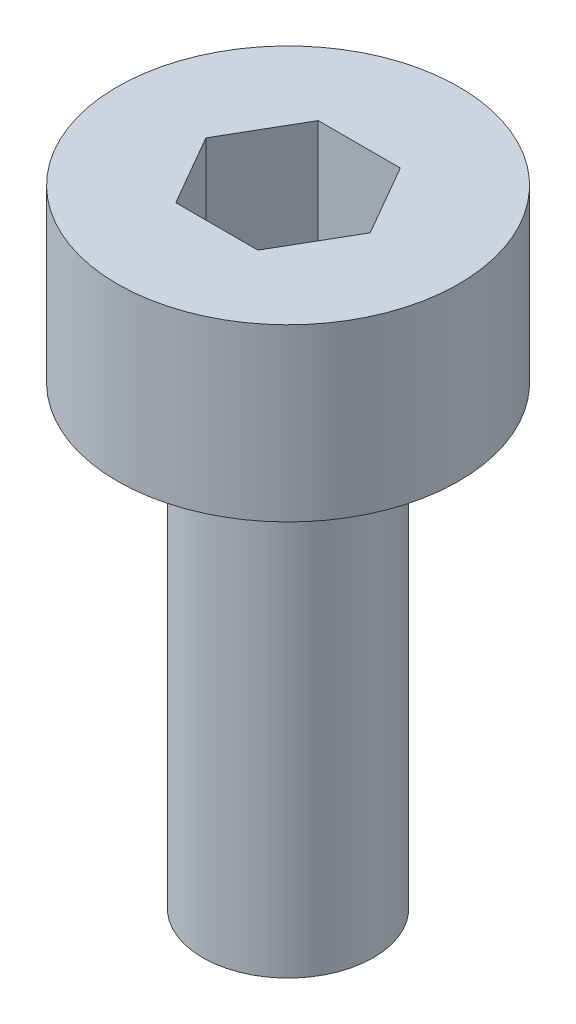
ISO-10303-21;
HEADER;
FILE_DESCRIPTION(('STEP AP214'),'2;1');
FILE_NAME('part.step','',(''),(''),'','','');
FILE_SCHEMA(('AUTOMOTIVE_DESIGN { 1 0 10303 214 1 1 1 1 }'));
ENDSEC;
DATA;
#1=APPLICATION_CONTEXT('core data for automotive mechanical design processes');
#2=APPLICATION_PROTOCOL_DEFINITION('international standard','automotive_design',2000,#1);
#3=PRODUCT_CONTEXT('',#1,'mechanical');
#4=PRODUCT('Part','Part','',(#3));
#5=PRODUCT_RELATED_PRODUCT_CATEGORY('part','',(#4));
#6=PRODUCT_DEFINITION_FORMATION('','',#4);
#7=PRODUCT_DEFINITION_CONTEXT('part definition',#1,'design');
#8=PRODUCT_DEFINITION('design','',#6,#7);
#9=PRODUCT_DEFINITION_SHAPE('','',#8);
#10=(LENGTH_UNIT() NAMED_UNIT(*) SI_UNIT(.MILLI.,.METRE.));
#11=(NAMED_UNIT(*) PLANE_ANGLE_UNIT() SI_UNIT($,.RADIAN.));
#12=(NAMED_UNIT(*) SI_UNIT($,.STERADIAN.) SOLID_ANGLE_UNIT());
#13=UNCERTAINTY_MEASURE_WITH_UNIT(LENGTH_MEASURE(1.E-05),#10,'distance_accuracy_value','');
#14=(GEOMETRIC_REPRESENTATION_CONTEXT(3) GLOBAL_UNCERTAINTY_ASSIGNED_CONTEXT((#13)) GLOBAL_UNIT_ASSIGNED_CONTEXT((#10,
#11,#12)) REPRESENTATION_CONTEXT('',''));
#15=CARTESIAN_POINT('',(0.,0.,0.));
#16=DIRECTION('',(0.,0.,1.));
#17=DIRECTION('',(1.,0.,0.));
#18=AXIS2_PLACEMENT_3D('',#15,#16,#17);
#19=CARTESIAN_POINT('',(0.,8.,0.));
#20=DIRECTION('',(0.,-1.,0.));
#21=DIRECTION('',(0.,0.,-1.));
#22=AXIS2_PLACEMENT_3D('',#19,#20,#21);
#23=CYLINDRICAL_SURFACE('',#22,1.5);
#24=CARTESIAN_POINT('',(0.,8.,0.));
#25=DIRECTION('',(0.,1.,0.));
#26=DIRECTION('',(0.,0.,1.));
#27=AXIS2_PLACEMENT_3D('',#24,#25,#26);
#28=CIRCLE('',#27,1.5);
#29=CARTESIAN_POINT('',(0.,8.,1.5));
#30=VERTEX_POINT('',#29);
#31=EDGE_CURVE('E11',#30,#30,#28,.T.);
#32=ORIENTED_EDGE('',*,*,#31,.F.);
#33=EDGE_LOOP('',(#32));
#34=FACE_BOUND('',#33,.T.);
#35=CARTESIAN_POINT('',(0.,0.,0.));
#36=DIRECTION('',(0.,1.,0.));
#37=DIRECTION('',(0.,0.,1.));
#38=AXIS2_PLACEMENT_3D('',#35,#36,#37);
#39=CIRCLE('',#38,1.5);
#40=CARTESIAN_POINT('',(0.,0.,1.5));
#41=VERTEX_POINT('',#40);
#42=EDGE_CURVE('E36',#41,#41,#39,.T.);
#43=ORIENTED_EDGE('',*,*,#42,.T.);
#44=EDGE_LOOP('',(#43));
#45=FACE_BOUND('',#44,.T.);
#46=ADVANCED_FACE('F33',(#34,#45),#23,.T.);
#47=CARTESIAN_POINT('',(0.,0.,0.));
#48=DIRECTION('',(0.,1.,0.));
#49=DIRECTION('',(0.,0.,1.));
#50=AXIS2_PLACEMENT_3D('',#47,#48,#49);
#51=PLANE('',#50);
#52=ORIENTED_EDGE('',*,*,#42,.F.);
#53=EDGE_LOOP('',(#52));
#54=FACE_BOUND('',#53,.T.);
#55=ADVANCED_FACE('F164',(#54),#51,.F.);
#56=CARTESIAN_POINT('',(0.,11.,0.));
#57=DIRECTION('',(0.,-1.,0.));
#58=DIRECTION('',(0.,0.,-1.));
#59=AXIS2_PLACEMENT_3D('',#56,#57,#58);
#60=CYLINDRICAL_SURFACE('',#59,3.);
#61=CARTESIAN_POINT('',(0.,11.,0.));
#62=DIRECTION('',(0.,1.,0.));
#63=DIRECTION('',(0.,0.,1.));
#64=AXIS2_PLACEMENT_3D('',#61,#62,#63);
#65=CIRCLE('',#64,3.);
#66=CARTESIAN_POINT('',(0.,11.,3.));
#67=VERTEX_POINT('',#66);
#68=EDGE_CURVE('E140',#67,#67,#65,.T.);
#69=ORIENTED_EDGE('',*,*,#68,.F.);
#70=EDGE_LOOP('',(#69));
#71=FACE_BOUND('',#70,.T.);
#72=CARTESIAN_POINT('',(0.,8.,0.));
#73=DIRECTION('',(0.,1.,0.));
#74=DIRECTION('',(0.,0.,1.));
#75=AXIS2_PLACEMENT_3D('',#72,#73,#74);
#76=CIRCLE('',#75,3.);
#77=CARTESIAN_POINT('',(0.,8.,3.));
#78=VERTEX_POINT('',#77);
#79=EDGE_CURVE('E134',#78,#78,#76,.T.);
#80=ORIENTED_EDGE('',*,*,#79,.T.);
#81=EDGE_LOOP('',(#80));
#82=FACE_BOUND('',#81,.T.);
#83=ADVANCED_FACE('F146',(#71,#82),#60,.T.);
#84=CARTESIAN_POINT('',(0.,11.,0.));
#85=DIRECTION('',(0.,1.,0.));
#86=DIRECTION('',(0.,0.,1.));
#87=AXIS2_PLACEMENT_3D('',#84,#85,#86);
#88=PLANE('',#87);
#89=DIRECTION('',(0.5,0.,-0.866025403784439));
#90=VECTOR('',#89,1.);
#91=CARTESIAN_POINT('',(0.721687836487032,11.,1.25));
#92=LINE('',#91,#90);
#93=CARTESIAN_POINT('',(0.721687836487032,11.,1.25));
#94=VERTEX_POINT('',#93);
#95=CARTESIAN_POINT('',(1.44337567297406,11.,0.));
#96=VERTEX_POINT('',#95);
#97=EDGE_CURVE('E47',#94,#96,#92,.T.);
#98=ORIENTED_EDGE('',*,*,#97,.F.);
#99=DIRECTION('',(1.,0.,0.));
#100=VECTOR('',#99,1.);
#101=CARTESIAN_POINT('',(-0.721687836487033,11.,1.25));
#102=LINE('',#101,#100);
#103=CARTESIAN_POINT('',(-0.721687836487033,11.,1.25));
#104=VERTEX_POINT('',#103);
#105=EDGE_CURVE('E130',#104,#94,#102,.T.);
#106=ORIENTED_EDGE('',*,*,#105,.F.);
#107=DIRECTION('',(0.5,0.,0.866025403784439));
#108=VECTOR('',#107,1.);
#109=CARTESIAN_POINT('',(-1.44337567297406,11.,0.));
#110=LINE('',#109,#108);
#111=CARTESIAN_POINT('',(-1.44337567297406,11.,0.));
#112=VERTEX_POINT('',#111);
#113=EDGE_CURVE('E128',#112,#104,#110,.T.);
#114=ORIENTED_EDGE('',*,*,#113,.F.);
#115=DIRECTION('',(-0.5,0.,0.866025403784438));
#116=VECTOR('',#115,1.);
#117=CARTESIAN_POINT('',(-0.721687836487032,11.,-1.25));
#118=LINE('',#117,#116);
#119=CARTESIAN_POINT('',(-0.721687836487032,11.,-1.25));
#120=VERTEX_POINT('',#119);
#121=EDGE_CURVE('E95',#120,#112,#118,.T.);
#122=ORIENTED_EDGE('',*,*,#121,.F.);
#123=DIRECTION('',(-1.,0.,0.));
#124=VECTOR('',#123,1.);
#125=CARTESIAN_POINT('',(0.721687836487032,11.,-1.25));
#126=LINE('',#125,#124);
#127=CARTESIAN_POINT('',(0.721687836487032,11.,-1.25));
#128=VERTEX_POINT('',#127);
#129=EDGE_CURVE('E124',#128,#120,#126,.T.);
#130=ORIENTED_EDGE('',*,*,#129,.F.);
#131=DIRECTION('',(-0.5,0.,-0.866025403784439));
#132=VECTOR('',#131,1.);
#133=CARTESIAN_POINT('',(1.44337567297406,11.,0.));
#134=LINE('',#133,#132);
#135=EDGE_CURVE('E121',#96,#128,#134,.T.);
#136=ORIENTED_EDGE('',*,*,#135,.F.);
#137=EDGE_LOOP('',(#98,#106,#114,#122,#130,#136));
#138=FACE_BOUND('',#137,.T.);
#139=ORIENTED_EDGE('',*,*,#68,.T.);
#140=EDGE_LOOP('',(#139));
#141=FACE_BOUND('',#140,.T.);
#142=ADVANCED_FACE('F151',(#138,#141),#88,.T.);
#143=CARTESIAN_POINT('',(0.,8.,0.));
#144=DIRECTION('',(0.,1.,0.));
#145=DIRECTION('',(0.,0.,1.));
#146=AXIS2_PLACEMENT_3D('',#143,#144,#145);
#147=PLANE('',#146);
#148=ORIENTED_EDGE('',*,*,#31,.T.);
#149=EDGE_LOOP('',(#148));
#150=FACE_BOUND('',#149,.T.);
#151=ORIENTED_EDGE('',*,*,#79,.F.);
#152=EDGE_LOOP('',(#151));
#153=FACE_BOUND('',#152,.T.);
#154=ADVANCED_FACE('F148',(#150,#153),#147,.F.);
#155=CARTESIAN_POINT('',(0.721687836487032,9.,1.25));
#156=DIRECTION('',(0.866025403784439,0.,0.5));
#157=DIRECTION('',(0.5,0.,-0.866025403784439));
#158=AXIS2_PLACEMENT_3D('',#155,#156,#157);
#159=PLANE('',#158);
#160=ORIENTED_EDGE('',*,*,#97,.T.);
#161=DIRECTION('',(0.,1.,0.));
#162=VECTOR('',#161,1.);
#163=CARTESIAN_POINT('',(1.44337567297406,9.,0.));
#164=LINE('',#163,#162);
#165=CARTESIAN_POINT('',(1.44337567297406,9.,0.));
#166=VERTEX_POINT('',#165);
#167=EDGE_CURVE('E77',#166,#96,#164,.T.);
#168=ORIENTED_EDGE('',*,*,#167,.F.);
#169=DIRECTION('',(0.5,0.,-0.866025403784439));
#170=VECTOR('',#169,1.);
#171=CARTESIAN_POINT('',(0.721687836487032,9.,1.25));
#172=LINE('',#171,#170);
#173=CARTESIAN_POINT('',(0.721687836487032,9.,1.25));
#174=VERTEX_POINT('',#173);
#175=EDGE_CURVE('E132',#174,#166,#172,.T.);
#176=ORIENTED_EDGE('',*,*,#175,.F.);
#177=DIRECTION('',(0.,1.,0.));
#178=VECTOR('',#177,1.);
#179=CARTESIAN_POINT('',(0.721687836487032,9.,1.25));
#180=LINE('',#179,#178);
#181=EDGE_CURVE('E55',#174,#94,#180,.T.);
#182=ORIENTED_EDGE('',*,*,#181,.T.);
#183=EDGE_LOOP('',(#160,#168,#176,#182));
#184=FACE_BOUND('',#183,.T.);
#185=ADVANCED_FACE('F150',(#184),#159,.F.);
#186=CARTESIAN_POINT('',(-0.721687836487033,9.,1.25));
#187=DIRECTION('',(0.,0.,1.));
#188=DIRECTION('',(1.,0.,0.));
#189=AXIS2_PLACEMENT_3D('',#186,#187,#188);
#190=PLANE('',#189);
#191=ORIENTED_EDGE('',*,*,#105,.T.);
#192=ORIENTED_EDGE('',*,*,#181,.F.);
#193=DIRECTION('',(1.,0.,0.));
#194=VECTOR('',#193,1.);
#195=CARTESIAN_POINT('',(-0.721687836487033,9.,1.25));
#196=LINE('',#195,#194);
#197=CARTESIAN_POINT('',(-0.721687836487033,9.,1.25));
#198=VERTEX_POINT('',#197);
#199=EDGE_CURVE('E107',#198,#174,#196,.T.);
#200=ORIENTED_EDGE('',*,*,#199,.F.);
#201=DIRECTION('',(0.,1.,0.));
#202=VECTOR('',#201,1.);
#203=CARTESIAN_POINT('',(-0.721687836487033,9.,1.25));
#204=LINE('',#203,#202);
#205=EDGE_CURVE('E99',#198,#104,#204,.T.);
#206=ORIENTED_EDGE('',*,*,#205,.T.);
#207=EDGE_LOOP('',(#191,#192,#200,#206));
#208=FACE_BOUND('',#207,.T.);
#209=ADVANCED_FACE('F158',(#208),#190,.F.);
#210=CARTESIAN_POINT('',(-1.44337567297406,9.,0.));
#211=DIRECTION('',(-0.866025403784439,0.,0.5));
#212=DIRECTION('',(0.5,0.,0.866025403784439));
#213=AXIS2_PLACEMENT_3D('',#210,#211,#212);
#214=PLANE('',#213);
#215=ORIENTED_EDGE('',*,*,#113,.T.);
#216=ORIENTED_EDGE('',*,*,#205,.F.);
#217=DIRECTION('',(0.5,0.,0.866025403784439));
#218=VECTOR('',#217,1.);
#219=CARTESIAN_POINT('',(-1.44337567297406,9.,0.));
#220=LINE('',#219,#218);
#221=CARTESIAN_POINT('',(-1.44337567297406,9.,0.));
#222=VERTEX_POINT('',#221);
#223=EDGE_CURVE('E103',#222,#198,#220,.T.);
#224=ORIENTED_EDGE('',*,*,#223,.F.);
#225=DIRECTION('',(0.,1.,0.));
#226=VECTOR('',#225,1.);
#227=CARTESIAN_POINT('',(-1.44337567297406,9.,0.));
#228=LINE('',#227,#226);
#229=EDGE_CURVE('E88',#222,#112,#228,.T.);
#230=ORIENTED_EDGE('',*,*,#229,.T.);
#231=EDGE_LOOP('',(#215,#216,#224,#230));
#232=FACE_BOUND('',#231,.T.);
#233=ADVANCED_FACE('F104',(#232),#214,.F.);
#234=CARTESIAN_POINT('',(-0.721687836487032,9.,-1.25));
#235=DIRECTION('',(-0.866025403784439,0.,-0.5));
#236=DIRECTION('',(-0.5,0.,0.866025403784438));
#237=AXIS2_PLACEMENT_3D('',#234,#235,#236);
#238=PLANE('',#237);
#239=ORIENTED_EDGE('',*,*,#121,.T.);
#240=ORIENTED_EDGE('',*,*,#229,.F.);
#241=DIRECTION('',(-0.5,0.,0.866025403784438));
#242=VECTOR('',#241,1.);
#243=CARTESIAN_POINT('',(-0.721687836487032,9.,-1.25));
#244=LINE('',#243,#242);
#245=CARTESIAN_POINT('',(-0.721687836487032,9.,-1.25));
#246=VERTEX_POINT('',#245);
#247=EDGE_CURVE('E92',#246,#222,#244,.T.);
#248=ORIENTED_EDGE('',*,*,#247,.F.);
#249=DIRECTION('',(0.,1.,0.));
#250=VECTOR('',#249,1.);
#251=CARTESIAN_POINT('',(-0.721687836487032,9.,-1.25));
#252=LINE('',#251,#250);
#253=EDGE_CURVE('E100',#246,#120,#252,.T.);
#254=ORIENTED_EDGE('',*,*,#253,.T.);
#255=EDGE_LOOP('',(#239,#240,#248,#254));
#256=FACE_BOUND('',#255,.T.);
#257=ADVANCED_FACE('F90',(#256),#238,.F.);
#258=CARTESIAN_POINT('',(0.721687836487032,9.,-1.25));
#259=DIRECTION('',(0.,0.,-1.));
#260=DIRECTION('',(-1.,0.,0.));
#261=AXIS2_PLACEMENT_3D('',#258,#259,#260);
#262=PLANE('',#261);
#263=ORIENTED_EDGE('',*,*,#129,.T.);
#264=ORIENTED_EDGE('',*,*,#253,.F.);
#265=DIRECTION('',(-1.,0.,0.));
#266=VECTOR('',#265,1.);
#267=CARTESIAN_POINT('',(0.721687836487032,9.,-1.25));
#268=LINE('',#267,#266);
#269=CARTESIAN_POINT('',(0.721687836487032,9.,-1.25));
#270=VERTEX_POINT('',#269);
#271=EDGE_CURVE('E113',#270,#246,#268,.T.);
#272=ORIENTED_EDGE('',*,*,#271,.F.);
#273=DIRECTION('',(0.,1.,0.));
#274=VECTOR('',#273,1.);
#275=CARTESIAN_POINT('',(0.721687836487032,9.,-1.25));
#276=LINE('',#275,#274);
#277=EDGE_CURVE('E137',#270,#128,#276,.T.);
#278=ORIENTED_EDGE('',*,*,#277,.T.);
#279=EDGE_LOOP('',(#263,#264,#272,#278));
#280=FACE_BOUND('',#279,.T.);
#281=ADVANCED_FACE('F219',(#280),#262,.F.);
#282=CARTESIAN_POINT('',(1.44337567297406,9.,0.));
#283=DIRECTION('',(0.866025403784439,0.,-0.5));
#284=DIRECTION('',(-0.5,0.,-0.866025403784439));
#285=AXIS2_PLACEMENT_3D('',#282,#283,#284);
#286=PLANE('',#285);
#287=ORIENTED_EDGE('',*,*,#135,.T.);
#288=ORIENTED_EDGE('',*,*,#277,.F.);
#289=DIRECTION('',(-0.5,0.,-0.866025403784439));
#290=VECTOR('',#289,1.);
#291=CARTESIAN_POINT('',(1.44337567297406,9.,0.));
#292=LINE('',#291,#290);
#293=EDGE_CURVE('E115',#166,#270,#292,.T.);
#294=ORIENTED_EDGE('',*,*,#293,.F.);
#295=ORIENTED_EDGE('',*,*,#167,.T.);
#296=EDGE_LOOP('',(#287,#288,#294,#295));
#297=FACE_BOUND('',#296,.T.);
#298=ADVANCED_FACE('F228',(#297),#286,.F.);
#299=CARTESIAN_POINT('',(0.,9.,0.));
#300=DIRECTION('',(0.,1.,0.));
#301=DIRECTION('',(0.,0.,1.));
#302=AXIS2_PLACEMENT_3D('',#299,#300,#301);
#303=PLANE('',#302);
#304=ORIENTED_EDGE('',*,*,#175,.T.);
#305=ORIENTED_EDGE('',*,*,#293,.T.);
#306=ORIENTED_EDGE('',*,*,#271,.T.);
#307=ORIENTED_EDGE('',*,*,#247,.T.);
#308=ORIENTED_EDGE('',*,*,#223,.T.);
#309=ORIENTED_EDGE('',*,*,#199,.T.);
#310=EDGE_LOOP('',(#304,#305,#306,#307,#308,#309));
#311=FACE_BOUND('',#310,.T.);
#312=ADVANCED_FACE('F110',(#311),#303,.T.);
#313=CLOSED_SHELL('',(#46,#55,#83,#142,#154,#185,#209,#233,#257,#281,#298,#312));
#314=MANIFOLD_SOLID_BREP('B2',#313);
#315=ADVANCED_BREP_SHAPE_REPRESENTATION('',(#18,#314),#14);
#316=SHAPE_DEFINITION_REPRESENTATION(#9,#315);
ENDSEC;
END-ISO-10303-21;
